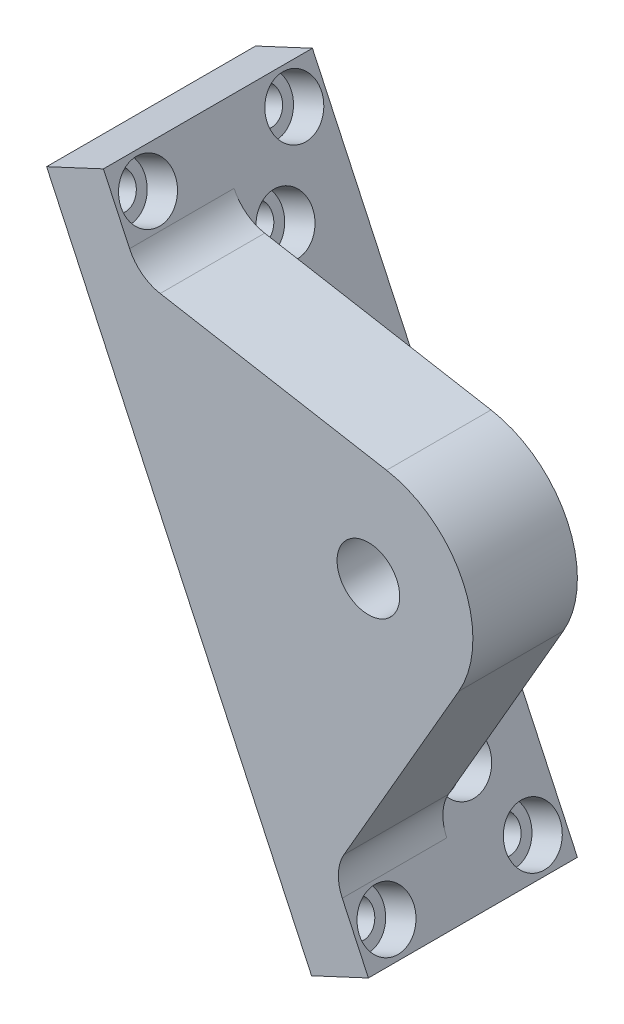
ISO-10303-21;
HEADER;
FILE_DESCRIPTION(('STEP AP214'),'2;1');
FILE_NAME('part.step','',(''),(''),'','','');
FILE_SCHEMA(('AUTOMOTIVE_DESIGN { 1 0 10303 214 1 1 1 1 }'));
ENDSEC;
DATA;
#1=APPLICATION_CONTEXT('core data for automotive mechanical design processes');
#2=APPLICATION_PROTOCOL_DEFINITION('international standard','automotive_design',2000,#1);
#3=PRODUCT_CONTEXT('',#1,'mechanical');
#4=PRODUCT('Part','Part','',(#3));
#5=PRODUCT_RELATED_PRODUCT_CATEGORY('part','',(#4));
#6=PRODUCT_DEFINITION_FORMATION('','',#4);
#7=PRODUCT_DEFINITION_CONTEXT('part definition',#1,'design');
#8=PRODUCT_DEFINITION('design','',#6,#7);
#9=PRODUCT_DEFINITION_SHAPE('','',#8);
#10=(LENGTH_UNIT() NAMED_UNIT(*) SI_UNIT(.MILLI.,.METRE.));
#11=(NAMED_UNIT(*) PLANE_ANGLE_UNIT() SI_UNIT($,.RADIAN.));
#12=(NAMED_UNIT(*) SI_UNIT($,.STERADIAN.) SOLID_ANGLE_UNIT());
#13=UNCERTAINTY_MEASURE_WITH_UNIT(LENGTH_MEASURE(1.E-05),#10,'distance_accuracy_value','');
#14=(GEOMETRIC_REPRESENTATION_CONTEXT(3) GLOBAL_UNCERTAINTY_ASSIGNED_CONTEXT((#13)) GLOBAL_UNIT_ASSIGNED_CONTEXT((#10,
#11,#12)) REPRESENTATION_CONTEXT('',''));
#15=CARTESIAN_POINT('',(0.,0.,0.));
#16=DIRECTION('',(0.,0.,1.));
#17=DIRECTION('',(1.,0.,0.));
#18=AXIS2_PLACEMENT_3D('',#15,#16,#17);
#19=CARTESIAN_POINT('',(-24.7746188840278,71.2007494086933,0.));
#20=DIRECTION('',(0.,0.,1.));
#21=DIRECTION('',(1.,0.,0.));
#22=AXIS2_PLACEMENT_3D('',#19,#20,#21);
#23=PLANE('',#22);
#24=DIRECTION('',(-0.4226182617407,0.90630778703665,0.));
#25=VECTOR('',#24,1.);
#26=CARTESIAN_POINT('',(-29.442801620826,27.6472680877639,0.));
#27=LINE('',#26,#25);
#28=CARTESIAN_POINT('',(-13.5946168055498,-6.3392739261105,0.));
#29=VERTEX_POINT('',#28);
#30=CARTESIAN_POINT('',(-76.9873560666547,129.606894129387,0.));
#31=VERTEX_POINT('',#30);
#32=EDGE_CURVE('E276',#29,#31,#27,.T.);
#33=ORIENTED_EDGE('',*,*,#32,.T.);
#34=DIRECTION('',(0.906307787036651,0.422618261740698,0.));
#35=VECTOR('',#34,1.);
#36=CARTESIAN_POINT('',(-77.8936638536913,129.184275867646,0.));
#37=LINE('',#36,#35);
#38=CARTESIAN_POINT('',(-63.3927392611049,135.946168055498,0.));
#39=VERTEX_POINT('',#38);
#40=EDGE_CURVE('E21',#31,#39,#37,.T.);
#41=ORIENTED_EDGE('',*,*,#40,.T.);
#42=DIRECTION('',(0.422618261740696,-0.906307787036652,0.));
#43=VECTOR('',#42,1.);
#44=CARTESIAN_POINT('',(-63.3927392611049,135.946168055498,0.));
#45=LINE('',#44,#43);
#46=CARTESIAN_POINT('',(0.,0.,0.));
#47=VERTEX_POINT('',#46);
#48=EDGE_CURVE('E400',#39,#47,#45,.T.);
#49=ORIENTED_EDGE('',*,*,#48,.T.);
#50=DIRECTION('',(-0.90630778703665,-0.4226182617407,0.));
#51=VECTOR('',#50,1.);
#52=CARTESIAN_POINT('',(0.,0.,0.));
#53=LINE('',#52,#51);
#54=EDGE_CURVE('E11',#47,#29,#53,.T.);
#55=ORIENTED_EDGE('',*,*,#54,.T.);
#56=EDGE_LOOP('',(#33,#41,#49,#55));
#57=FACE_BOUND('',#56,.T.);
#58=ADVANCED_FACE('F17',(#57),#23,.F.);
#59=CARTESIAN_POINT('',(0.,0.,0.));
#60=DIRECTION('',(0.4226182617407,-0.90630778703665,0.));
#61=DIRECTION('',(0.,0.,-1.));
#62=AXIS2_PLACEMENT_3D('',#59,#60,#61);
#63=PLANE('',#62);
#64=DIRECTION('',(0.,0.,-1.));
#65=VECTOR('',#64,1.);
#66=CARTESIAN_POINT('',(-13.5946168055498,-6.3392739261105,0.));
#67=LINE('',#66,#65);
#68=CARTESIAN_POINT('',(-13.5946168055498,-6.3392739261105,50.));
#69=VERTEX_POINT('',#68);
#70=EDGE_CURVE('E251',#69,#29,#67,.T.);
#71=ORIENTED_EDGE('',*,*,#70,.T.);
#72=ORIENTED_EDGE('',*,*,#54,.F.);
#73=DIRECTION('',(0.,0.,1.));
#74=VECTOR('',#73,1.);
#75=CARTESIAN_POINT('',(0.,0.,0.));
#76=LINE('',#75,#74);
#77=CARTESIAN_POINT('',(0.,0.,50.));
#78=VERTEX_POINT('',#77);
#79=EDGE_CURVE('E254',#47,#78,#76,.T.);
#80=ORIENTED_EDGE('',*,*,#79,.T.);
#81=DIRECTION('',(-0.90630778703665,-0.4226182617407,0.));
#82=VECTOR('',#81,1.);
#83=CARTESIAN_POINT('',(0.,0.,50.));
#84=LINE('',#83,#82);
#85=EDGE_CURVE('E247',#78,#69,#84,.T.);
#86=ORIENTED_EDGE('',*,*,#85,.T.);
#87=EDGE_LOOP('',(#71,#72,#80,#86));
#88=FACE_BOUND('',#87,.T.);
#89=ADVANCED_FACE('F249',(#88),#63,.T.);
#90=CARTESIAN_POINT('',(-77.8936638536913,129.184275867646,0.));
#91=DIRECTION('',(-0.422618261740698,0.906307787036651,0.));
#92=DIRECTION('',(0.,0.,1.));
#93=AXIS2_PLACEMENT_3D('',#90,#91,#92);
#94=PLANE('',#93);
#95=DIRECTION('',(0.,0.,1.));
#96=VECTOR('',#95,1.);
#97=CARTESIAN_POINT('',(-76.9873560666547,129.606894129387,0.));
#98=LINE('',#97,#96);
#99=CARTESIAN_POINT('',(-76.9873560666547,129.606894129387,50.));
#100=VERTEX_POINT('',#99);
#101=EDGE_CURVE('E283',#31,#100,#98,.T.);
#102=ORIENTED_EDGE('',*,*,#101,.T.);
#103=DIRECTION('',(0.906307787036651,0.422618261740698,0.));
#104=VECTOR('',#103,1.);
#105=CARTESIAN_POINT('',(-77.8936638536913,129.184275867646,50.));
#106=LINE('',#105,#104);
#107=CARTESIAN_POINT('',(-63.3927392611049,135.946168055498,50.));
#108=VERTEX_POINT('',#107);
#109=EDGE_CURVE('E267',#100,#108,#106,.T.);
#110=ORIENTED_EDGE('',*,*,#109,.T.);
#111=DIRECTION('',(0.,0.,1.));
#112=VECTOR('',#111,1.);
#113=CARTESIAN_POINT('',(-63.3927392611049,135.946168055498,0.));
#114=LINE('',#113,#112);
#115=EDGE_CURVE('E337',#39,#108,#114,.T.);
#116=ORIENTED_EDGE('',*,*,#115,.F.);
#117=ORIENTED_EDGE('',*,*,#40,.F.);
#118=EDGE_LOOP('',(#102,#110,#116,#117));
#119=FACE_BOUND('',#118,.T.);
#120=ADVANCED_FACE('F935',(#119),#94,.T.);
#121=CARTESIAN_POINT('',(-54.940374026291,117.820012314764,0.));
#122=DIRECTION('',(0.173543976887941,0.984826120737015,0.));
#123=DIRECTION('',(0.,0.,-1.));
#124=AXIS2_PLACEMENT_3D('',#121,#122,#123);
#125=PLANE('',#124);
#126=DIRECTION('',(0.,0.,-1.));
#127=VECTOR('',#126,1.);
#128=CARTESIAN_POINT('',(-49.8130315213259,116.91648285871,0.));
#129=LINE('',#128,#127);
#130=CARTESIAN_POINT('',(-49.8130315213259,116.91648285871,50.));
#131=VERTEX_POINT('',#130);
#132=CARTESIAN_POINT('',(-49.8130315213259,116.91648285871,25.));
#133=VERTEX_POINT('',#132);
#134=EDGE_CURVE('E307',#131,#133,#129,.T.);
#135=ORIENTED_EDGE('',*,*,#134,.F.);
#136=DIRECTION('',(0.984826120737015,-0.173543976887941,0.));
#137=VECTOR('',#136,1.);
#138=CARTESIAN_POINT('',(-54.940374026291,117.820012314764,50.));
#139=LINE('',#138,#137);
#140=CARTESIAN_POINT('',(4.33859942219853,107.373996940612,50.));
#141=VERTEX_POINT('',#140);
#142=EDGE_CURVE('E302',#131,#141,#139,.T.);
#143=ORIENTED_EDGE('',*,*,#142,.T.);
#144=DIRECTION('',(0.,0.,1.));
#145=VECTOR('',#144,1.);
#146=CARTESIAN_POINT('',(4.33859942219853,107.373996940612,0.));
#147=LINE('',#146,#145);
#148=CARTESIAN_POINT('',(4.33859942219853,107.373996940612,25.));
#149=VERTEX_POINT('',#148);
#150=EDGE_CURVE('E39',#149,#141,#147,.T.);
#151=ORIENTED_EDGE('',*,*,#150,.F.);
#152=DIRECTION('',(-0.984826120737015,0.173543976887941,0.));
#153=VECTOR('',#152,1.);
#154=CARTESIAN_POINT('',(-18.2291737525584,111.350842216935,25.));
#155=LINE('',#154,#153);
#156=EDGE_CURVE('E380',#149,#133,#155,.T.);
#157=ORIENTED_EDGE('',*,*,#156,.T.);
#158=EDGE_LOOP('',(#135,#143,#151,#157));
#159=FACE_BOUND('',#158,.T.);
#160=ADVANCED_FACE('F897',(#159),#125,.T.);
#161=CARTESIAN_POINT('',(0.,82.7533439221869,0.));
#162=DIRECTION('',(0.,0.,1.));
#163=DIRECTION('',(-0.865972495308307,0.500091628973636,0.));
#164=AXIS2_PLACEMENT_3D('',#161,#162,#163);
#165=CYLINDRICAL_SURFACE('',#164,25.);
#166=CARTESIAN_POINT('',(0.,82.7533439221869,25.));
#167=DIRECTION('',(0.,0.,1.));
#168=DIRECTION('',(-0.865972495308307,0.500091628973636,0.));
#169=AXIS2_PLACEMENT_3D('',#166,#167,#168);
#170=CIRCLE('',#169,25.);
#171=CARTESIAN_POINT('',(21.6493123827077,70.251053197846,25.));
#172=VERTEX_POINT('',#171);
#173=EDGE_CURVE('E377',#172,#149,#170,.T.);
#174=ORIENTED_EDGE('',*,*,#173,.T.);
#175=ORIENTED_EDGE('',*,*,#150,.T.);
#176=CARTESIAN_POINT('',(0.,82.7533439221869,50.));
#177=DIRECTION('',(0.,0.,-1.));
#178=DIRECTION('',(-0.865972495308307,0.500091628973636,0.));
#179=AXIS2_PLACEMENT_3D('',#176,#177,#178);
#180=CIRCLE('',#179,25.);
#181=CARTESIAN_POINT('',(21.6493123827077,70.251053197846,50.));
#182=VERTEX_POINT('',#181);
#183=EDGE_CURVE('E306',#141,#182,#180,.T.);
#184=ORIENTED_EDGE('',*,*,#183,.T.);
#185=DIRECTION('',(0.,0.,1.));
#186=VECTOR('',#185,1.);
#187=CARTESIAN_POINT('',(21.6493123827077,70.251053197846,0.));
#188=LINE('',#187,#186);
#189=EDGE_CURVE('E338',#172,#182,#188,.T.);
#190=ORIENTED_EDGE('',*,*,#189,.F.);
#191=EDGE_LOOP('',(#174,#175,#184,#190));
#192=FACE_BOUND('',#191,.T.);
#193=ADVANCED_FACE('F892',(#192),#165,.T.);
#194=CARTESIAN_POINT('',(0.,0.,25.));
#195=DIRECTION('',(0.,0.,1.));
#196=DIRECTION('',(1.,0.,0.));
#197=AXIS2_PLACEMENT_3D('',#194,#195,#196);
#198=PLANE('',#197);
#199=CARTESIAN_POINT('',(0.,82.7533439221869,25.));
#200=DIRECTION('',(0.,0.,1.));
#201=DIRECTION('',(-1.,0.,0.));
#202=AXIS2_PLACEMENT_3D('',#199,#200,#201);
#203=CIRCLE('',#202,7.5);
#204=CARTESIAN_POINT('',(7.5,82.7533439221869,25.));
#205=VERTEX_POINT('',#204);
#206=EDGE_CURVE('E357',#205,#205,#203,.T.);
#207=ORIENTED_EDGE('',*,*,#206,.T.);
#208=EDGE_LOOP('',(#207));
#209=FACE_BOUND('',#208,.T.);
#210=DIRECTION('',(0.4226182617407,-0.90630778703665,0.));
#211=VECTOR('',#210,1.);
#212=CARTESIAN_POINT('',(-4.226182617407,9.0630778703665,25.));
#213=LINE('',#212,#211);
#214=CARTESIAN_POINT('',(-57.140669622813,122.538561448673,25.));
#215=VERTEX_POINT('',#214);
#216=CARTESIAN_POINT('',(-6.25206963829196,13.4076066068248,25.));
#217=VERTEX_POINT('',#216);
#218=EDGE_CURVE('E333',#215,#217,#213,.T.);
#219=ORIENTED_EDGE('',*,*,#218,.F.);
#220=CARTESIAN_POINT('',(-48.0775917524465,126.76474406608,25.));
#221=DIRECTION('',(0.,0.,-1.));
#222=DIRECTION('',(-0.608719456886394,-0.793385544869538,0.));
#223=AXIS2_PLACEMENT_3D('',#220,#221,#222);
#224=CIRCLE('',#223,10.);
#225=EDGE_CURVE('E342',#133,#215,#224,.T.);
#226=ORIENTED_EDGE('',*,*,#225,.F.);
#227=ORIENTED_EDGE('',*,*,#156,.F.);
#228=ORIENTED_EDGE('',*,*,#173,.F.);
#229=DIRECTION('',(0.500091628973637,0.865972495308306,0.));
#230=VECTOR('',#229,1.);
#231=CARTESIAN_POINT('',(3.73049928661717,39.2223408764033,25.));
#232=LINE('',#231,#230);
#233=CARTESIAN_POINT('',(-5.84871672100853,22.6347055139682,25.));
#234=VERTEX_POINT('',#233);
#235=EDGE_CURVE('E343',#234,#172,#232,.T.);
#236=ORIENTED_EDGE('',*,*,#235,.F.);
#237=CARTESIAN_POINT('',(2.81100823207453,17.6337892242318,25.));
#238=DIRECTION('',(0.,0.,-1.));
#239=DIRECTION('',(-0.999045912559926,0.0436722405803167,0.));
#240=AXIS2_PLACEMENT_3D('',#237,#238,#239);
#241=CIRCLE('',#240,10.);
#242=EDGE_CURVE('E291',#217,#234,#241,.T.);
#243=ORIENTED_EDGE('',*,*,#242,.F.);
#244=EDGE_LOOP('',(#219,#226,#227,#228,#236,#243));
#245=FACE_BOUND('',#244,.T.);
#246=ADVANCED_FACE('F847',(#209,#245),#198,.F.);
#247=CARTESIAN_POINT('',(-12.2327148334217,2.57112578536788,42.5));
#248=DIRECTION('',(0.90630778703665,0.4226182617407,0.));
#249=DIRECTION('',(0.,0.,-1.));
#250=AXIS2_PLACEMENT_3D('',#247,#248,#249);
#251=CYLINDRICAL_SURFACE('',#250,4.1);
#252=CARTESIAN_POINT('',(-10.4200992593484,3.41636230884927,42.5));
#253=DIRECTION('',(0.90630778703665,0.4226182617407,0.));
#254=DIRECTION('',(0.,0.,-1.));
#255=AXIS2_PLACEMENT_3D('',#252,#253,#254);
#256=CIRCLE('',#255,4.1);
#257=CARTESIAN_POINT('',(-10.4200992593484,3.41636230884927,46.6));
#258=VERTEX_POINT('',#257);
#259=EDGE_CURVE('E315',#258,#258,#256,.T.);
#260=ORIENTED_EDGE('',*,*,#259,.T.);
#261=DIRECTION('',(-0.90630778703665,-0.4226182617407,0.));
#262=VECTOR('',#261,1.);
#263=CARTESIAN_POINT('',(-12.2327148334217,2.57112578536788,46.6));
#264=LINE('',#263,#262);
#265=CARTESIAN_POINT('',(-16.764253768605,0.458034476664371,46.6));
#266=VERTEX_POINT('',#265);
#267=EDGE_CURVE('E52',#258,#266,#264,.T.);
#268=ORIENTED_EDGE('',*,*,#267,.T.);
#269=CARTESIAN_POINT('',(-16.764253768605,0.458034476664371,42.5));
#270=DIRECTION('',(-0.90630778703665,-0.4226182617407,0.));
#271=DIRECTION('',(0.,0.,-1.));
#272=AXIS2_PLACEMENT_3D('',#269,#270,#271);
#273=CIRCLE('',#272,4.1);
#274=EDGE_CURVE('E260',#266,#266,#273,.T.);
#275=ORIENTED_EDGE('',*,*,#274,.T.);
#276=ORIENTED_EDGE('',*,*,#267,.F.);
#277=EDGE_LOOP('',(#260,#268,#275,#276));
#278=FACE_BOUND('',#277,.T.);
#279=ADVANCED_FACE('F838',(#278),#251,.F.);
#280=CARTESIAN_POINT('',(-6.79486811120184,5.10683535581207,42.5));
#281=DIRECTION('',(0.90630778703665,0.4226182617407,0.));
#282=DIRECTION('',(0.,0.,-1.));
#283=AXIS2_PLACEMENT_3D('',#280,#281,#282);
#284=CYLINDRICAL_SURFACE('',#283,6.5);
#285=CARTESIAN_POINT('',(-3.16963696305525,6.79730840277487,42.5));
#286=DIRECTION('',(-0.90630778703665,-0.4226182617407,0.));
#287=DIRECTION('',(0.,0.,-1.));
#288=AXIS2_PLACEMENT_3D('',#285,#286,#287);
#289=CIRCLE('',#288,6.5);
#290=CARTESIAN_POINT('',(-3.16963696305525,6.79730840277487,49.));
#291=VERTEX_POINT('',#290);
#292=EDGE_CURVE('E336',#291,#291,#289,.T.);
#293=ORIENTED_EDGE('',*,*,#292,.F.);
#294=DIRECTION('',(-0.90630778703665,-0.4226182617407,0.));
#295=VECTOR('',#294,1.);
#296=CARTESIAN_POINT('',(-6.79486811120184,5.10683535581207,49.));
#297=LINE('',#296,#295);
#298=CARTESIAN_POINT('',(-10.4200992593484,3.41636230884927,49.));
#299=VERTEX_POINT('',#298);
#300=EDGE_CURVE('E312',#291,#299,#297,.T.);
#301=ORIENTED_EDGE('',*,*,#300,.T.);
#302=CARTESIAN_POINT('',(-10.4200992593484,3.41636230884927,42.5));
#303=DIRECTION('',(0.90630778703665,0.4226182617407,0.));
#304=DIRECTION('',(0.,0.,-1.));
#305=AXIS2_PLACEMENT_3D('',#302,#303,#304);
#306=CIRCLE('',#305,6.5);
#307=EDGE_CURVE('E353',#299,#299,#306,.T.);
#308=ORIENTED_EDGE('',*,*,#307,.F.);
#309=ORIENTED_EDGE('',*,*,#300,.F.);
#310=EDGE_LOOP('',(#293,#301,#308,#309));
#311=FACE_BOUND('',#310,.T.);
#312=ADVANCED_FACE('F493',(#311),#284,.F.);
#313=CARTESIAN_POINT('',(-10.4200992593484,3.41636230884927,42.5));
#314=DIRECTION('',(0.90630778703665,0.4226182617407,0.));
#315=DIRECTION('',(0.,0.,-1.));
#316=AXIS2_PLACEMENT_3D('',#313,#314,#315);
#317=PLANE('',#316);
#318=ORIENTED_EDGE('',*,*,#259,.F.);
#319=EDGE_LOOP('',(#318));
#320=FACE_BOUND('',#319,.T.);
#321=ORIENTED_EDGE('',*,*,#307,.T.);
#322=EDGE_LOOP('',(#321));
#323=FACE_BOUND('',#322,.T.);
#324=ADVANCED_FACE('F490',(#320,#323),#317,.T.);
#325=CARTESIAN_POINT('',(-12.2327148334217,2.57112578536788,7.5));
#326=DIRECTION('',(0.90630778703665,0.4226182617407,0.));
#327=DIRECTION('',(0.,0.,-1.));
#328=AXIS2_PLACEMENT_3D('',#325,#326,#327);
#329=CYLINDRICAL_SURFACE('',#328,4.1);
#330=CARTESIAN_POINT('',(-10.4200992593484,3.41636230884927,7.5));
#331=DIRECTION('',(0.90630778703665,0.4226182617407,0.));
#332=DIRECTION('',(0.,0.,-1.));
#333=AXIS2_PLACEMENT_3D('',#330,#331,#332);
#334=CIRCLE('',#333,4.1);
#335=CARTESIAN_POINT('',(-10.4200992593484,3.41636230884927,11.6));
#336=VERTEX_POINT('',#335);
#337=EDGE_CURVE('E376',#336,#336,#334,.T.);
#338=ORIENTED_EDGE('',*,*,#337,.T.);
#339=DIRECTION('',(-0.90630778703665,-0.4226182617407,0.));
#340=VECTOR('',#339,1.);
#341=CARTESIAN_POINT('',(-12.2327148334217,2.57112578536788,11.6));
#342=LINE('',#341,#340);
#343=CARTESIAN_POINT('',(-16.764253768605,0.458034476664371,11.6));
#344=VERTEX_POINT('',#343);
#345=EDGE_CURVE('E375',#336,#344,#342,.T.);
#346=ORIENTED_EDGE('',*,*,#345,.T.);
#347=CARTESIAN_POINT('',(-16.764253768605,0.458034476664371,7.5));
#348=DIRECTION('',(-0.90630778703665,-0.4226182617407,0.));
#349=DIRECTION('',(0.,0.,-1.));
#350=AXIS2_PLACEMENT_3D('',#347,#348,#349);
#351=CIRCLE('',#350,4.1);
#352=EDGE_CURVE('E439',#344,#344,#351,.T.);
#353=ORIENTED_EDGE('',*,*,#352,.T.);
#354=ORIENTED_EDGE('',*,*,#345,.F.);
#355=EDGE_LOOP('',(#338,#346,#353,#354));
#356=FACE_BOUND('',#355,.T.);
#357=ADVANCED_FACE('F855',(#356),#329,.F.);
#358=CARTESIAN_POINT('',(-6.79486811120184,5.10683535581207,7.5));
#359=DIRECTION('',(0.90630778703665,0.4226182617407,0.));
#360=DIRECTION('',(0.,0.,-1.));
#361=AXIS2_PLACEMENT_3D('',#358,#359,#360);
#362=CYLINDRICAL_SURFACE('',#361,6.5);
#363=CARTESIAN_POINT('',(-3.16963696305525,6.79730840277487,7.5));
#364=DIRECTION('',(-0.90630778703665,-0.4226182617407,0.));
#365=DIRECTION('',(0.,0.,-1.));
#366=AXIS2_PLACEMENT_3D('',#363,#364,#365);
#367=CIRCLE('',#366,6.5);
#368=CARTESIAN_POINT('',(-3.16963696305525,6.79730840277487,14.));
#369=VERTEX_POINT('',#368);
#370=EDGE_CURVE('E386',#369,#369,#367,.T.);
#371=ORIENTED_EDGE('',*,*,#370,.F.);
#372=DIRECTION('',(-0.90630778703665,-0.4226182617407,0.));
#373=VECTOR('',#372,1.);
#374=CARTESIAN_POINT('',(-6.79486811120184,5.10683535581207,14.));
#375=LINE('',#374,#373);
#376=CARTESIAN_POINT('',(-10.4200992593484,3.41636230884927,14.));
#377=VERTEX_POINT('',#376);
#378=EDGE_CURVE('E372',#369,#377,#375,.T.);
#379=ORIENTED_EDGE('',*,*,#378,.T.);
#380=CARTESIAN_POINT('',(-10.4200992593484,3.41636230884927,7.5));
#381=DIRECTION('',(0.90630778703665,0.4226182617407,0.));
#382=DIRECTION('',(0.,0.,-1.));
#383=AXIS2_PLACEMENT_3D('',#380,#381,#382);
#384=CIRCLE('',#383,6.5);
#385=EDGE_CURVE('E479',#377,#377,#384,.T.);
#386=ORIENTED_EDGE('',*,*,#385,.F.);
#387=ORIENTED_EDGE('',*,*,#378,.F.);
#388=EDGE_LOOP('',(#371,#379,#386,#387));
#389=FACE_BOUND('',#388,.T.);
#390=ADVANCED_FACE('F926',(#389),#362,.F.);
#391=CARTESIAN_POINT('',(-10.4200992593484,3.41636230884927,7.5));
#392=DIRECTION('',(0.90630778703665,0.4226182617407,0.));
#393=DIRECTION('',(0.,0.,-1.));
#394=AXIS2_PLACEMENT_3D('',#391,#392,#393);
#395=PLANE('',#394);
#396=ORIENTED_EDGE('',*,*,#337,.F.);
#397=EDGE_LOOP('',(#396));
#398=FACE_BOUND('',#397,.T.);
#399=ORIENTED_EDGE('',*,*,#385,.T.);
#400=EDGE_LOOP('',(#399));
#401=FACE_BOUND('',#400,.T.);
#402=ADVANCED_FACE('F921',(#398,#401),#395,.T.);
#403=CARTESIAN_POINT('',(-69.2861801684162,124.922677035316,7.5));
#404=DIRECTION('',(0.90630778703665,0.4226182617407,0.));
#405=DIRECTION('',(0.,0.,-1.));
#406=AXIS2_PLACEMENT_3D('',#403,#404,#405);
#407=CYLINDRICAL_SURFACE('',#406,4.1);
#408=CARTESIAN_POINT('',(-67.4735645943429,125.767913558797,7.5));
#409=DIRECTION('',(0.90630778703665,0.4226182617407,0.));
#410=DIRECTION('',(0.,0.,-1.));
#411=AXIS2_PLACEMENT_3D('',#408,#409,#410);
#412=CIRCLE('',#411,4.1);
#413=CARTESIAN_POINT('',(-67.4735645943429,125.767913558797,11.6));
#414=VERTEX_POINT('',#413);
#415=EDGE_CURVE('E287',#414,#414,#412,.T.);
#416=ORIENTED_EDGE('',*,*,#415,.T.);
#417=DIRECTION('',(-0.90630778703665,-0.4226182617407,0.));
#418=VECTOR('',#417,1.);
#419=CARTESIAN_POINT('',(-69.2861801684162,124.922677035316,11.6));
#420=LINE('',#419,#418);
#421=CARTESIAN_POINT('',(-73.8177191035995,122.809585726612,11.6));
#422=VERTEX_POINT('',#421);
#423=EDGE_CURVE('E412',#414,#422,#420,.T.);
#424=ORIENTED_EDGE('',*,*,#423,.T.);
#425=CARTESIAN_POINT('',(-73.8177191035995,122.809585726612,7.5));
#426=DIRECTION('',(-0.90630778703665,-0.4226182617407,0.));
#427=DIRECTION('',(0.,0.,-1.));
#428=AXIS2_PLACEMENT_3D('',#425,#426,#427);
#429=CIRCLE('',#428,4.1);
#430=EDGE_CURVE('E456',#422,#422,#429,.T.);
#431=ORIENTED_EDGE('',*,*,#430,.T.);
#432=ORIENTED_EDGE('',*,*,#423,.F.);
#433=EDGE_LOOP('',(#416,#424,#431,#432));
#434=FACE_BOUND('',#433,.T.);
#435=ADVANCED_FACE('F828',(#434),#407,.F.);
#436=CARTESIAN_POINT('',(-63.8483334461963,127.45838660576,7.5));
#437=DIRECTION('',(0.90630778703665,0.4226182617407,0.));
#438=DIRECTION('',(0.,0.,-1.));
#439=AXIS2_PLACEMENT_3D('',#436,#437,#438);
#440=CYLINDRICAL_SURFACE('',#439,6.5);
#441=CARTESIAN_POINT('',(-60.2231022980497,129.148859652723,7.5));
#442=DIRECTION('',(-0.90630778703665,-0.4226182617407,0.));
#443=DIRECTION('',(0.,0.,-1.));
#444=AXIS2_PLACEMENT_3D('',#441,#442,#443);
#445=CIRCLE('',#444,6.5);
#446=CARTESIAN_POINT('',(-60.2231022980497,129.148859652723,14.));
#447=VERTEX_POINT('',#446);
#448=EDGE_CURVE('E390',#447,#447,#445,.T.);
#449=ORIENTED_EDGE('',*,*,#448,.F.);
#450=DIRECTION('',(-0.90630778703665,-0.4226182617407,0.));
#451=VECTOR('',#450,1.);
#452=CARTESIAN_POINT('',(-63.8483334461963,127.45838660576,14.));
#453=LINE('',#452,#451);
#454=CARTESIAN_POINT('',(-67.4735645943429,125.767913558797,14.));
#455=VERTEX_POINT('',#454);
#456=EDGE_CURVE('E409',#447,#455,#453,.T.);
#457=ORIENTED_EDGE('',*,*,#456,.T.);
#458=CARTESIAN_POINT('',(-67.4735645943429,125.767913558797,7.5));
#459=DIRECTION('',(0.90630778703665,0.4226182617407,0.));
#460=DIRECTION('',(0.,0.,-1.));
#461=AXIS2_PLACEMENT_3D('',#458,#459,#460);
#462=CIRCLE('',#461,6.5);
#463=EDGE_CURVE('E429',#455,#455,#462,.T.);
#464=ORIENTED_EDGE('',*,*,#463,.F.);
#465=ORIENTED_EDGE('',*,*,#456,.F.);
#466=EDGE_LOOP('',(#449,#457,#464,#465));
#467=FACE_BOUND('',#466,.T.);
#468=ADVANCED_FACE('F799',(#467),#440,.F.);
#469=CARTESIAN_POINT('',(-67.4735645943429,125.767913558797,7.5));
#470=DIRECTION('',(0.90630778703665,0.4226182617407,0.));
#471=DIRECTION('',(0.,0.,-1.));
#472=AXIS2_PLACEMENT_3D('',#469,#470,#471);
#473=PLANE('',#472);
#474=ORIENTED_EDGE('',*,*,#415,.F.);
#475=EDGE_LOOP('',(#474));
#476=FACE_BOUND('',#475,.T.);
#477=ORIENTED_EDGE('',*,*,#463,.T.);
#478=EDGE_LOOP('',(#477));
#479=FACE_BOUND('',#478,.T.);
#480=ADVANCED_FACE('F793',(#476,#479),#473,.T.);
#481=CARTESIAN_POINT('',(-69.2861801684162,124.922677035316,42.5));
#482=DIRECTION('',(0.90630778703665,0.4226182617407,0.));
#483=DIRECTION('',(0.,0.,-1.));
#484=AXIS2_PLACEMENT_3D('',#481,#482,#483);
#485=CYLINDRICAL_SURFACE('',#484,4.1);
#486=CARTESIAN_POINT('',(-67.4735645943429,125.767913558797,42.5));
#487=DIRECTION('',(0.90630778703665,0.4226182617407,0.));
#488=DIRECTION('',(0.,0.,-1.));
#489=AXIS2_PLACEMENT_3D('',#486,#487,#488);
#490=CIRCLE('',#489,4.1);
#491=CARTESIAN_POINT('',(-67.4735645943429,125.767913558797,46.6));
#492=VERTEX_POINT('',#491);
#493=EDGE_CURVE('E436',#492,#492,#490,.T.);
#494=ORIENTED_EDGE('',*,*,#493,.T.);
#495=DIRECTION('',(-0.90630778703665,-0.4226182617407,0.));
#496=VECTOR('',#495,1.);
#497=CARTESIAN_POINT('',(-69.2861801684162,124.922677035316,46.6));
#498=LINE('',#497,#496);
#499=CARTESIAN_POINT('',(-73.8177191035995,122.809585726612,46.6));
#500=VERTEX_POINT('',#499);
#501=EDGE_CURVE('E433',#492,#500,#498,.T.);
#502=ORIENTED_EDGE('',*,*,#501,.T.);
#503=CARTESIAN_POINT('',(-73.8177191035995,122.809585726612,42.5));
#504=DIRECTION('',(-0.90630778703665,-0.4226182617407,0.));
#505=DIRECTION('',(0.,0.,-1.));
#506=AXIS2_PLACEMENT_3D('',#503,#504,#505);
#507=CIRCLE('',#506,4.1);
#508=EDGE_CURVE('E346',#500,#500,#507,.T.);
#509=ORIENTED_EDGE('',*,*,#508,.T.);
#510=ORIENTED_EDGE('',*,*,#501,.F.);
#511=EDGE_LOOP('',(#494,#502,#509,#510));
#512=FACE_BOUND('',#511,.T.);
#513=ADVANCED_FACE('F798',(#512),#485,.F.);
#514=CARTESIAN_POINT('',(-63.8483334461963,127.45838660576,42.5));
#515=DIRECTION('',(0.90630778703665,0.4226182617407,0.));
#516=DIRECTION('',(0.,0.,-1.));
#517=AXIS2_PLACEMENT_3D('',#514,#515,#516);
#518=CYLINDRICAL_SURFACE('',#517,6.5);
#519=CARTESIAN_POINT('',(-60.2231022980497,129.148859652723,42.5));
#520=DIRECTION('',(-0.90630778703665,-0.4226182617407,0.));
#521=DIRECTION('',(0.,0.,-1.));
#522=AXIS2_PLACEMENT_3D('',#519,#520,#521);
#523=CIRCLE('',#522,6.5);
#524=CARTESIAN_POINT('',(-60.2231022980497,129.148859652723,49.));
#525=VERTEX_POINT('',#524);
#526=EDGE_CURVE('E394',#525,#525,#523,.T.);
#527=ORIENTED_EDGE('',*,*,#526,.F.);
#528=DIRECTION('',(-0.90630778703665,-0.4226182617407,0.));
#529=VECTOR('',#528,1.);
#530=CARTESIAN_POINT('',(-63.8483334461963,127.45838660576,49.));
#531=LINE('',#530,#529);
#532=CARTESIAN_POINT('',(-67.4735645943429,125.767913558797,49.));
#533=VERTEX_POINT('',#532);
#534=EDGE_CURVE('E129',#525,#533,#531,.T.);
#535=ORIENTED_EDGE('',*,*,#534,.T.);
#536=CARTESIAN_POINT('',(-67.4735645943429,125.767913558797,42.5));
#537=DIRECTION('',(0.90630778703665,0.4226182617407,0.));
#538=DIRECTION('',(0.,0.,-1.));
#539=AXIS2_PLACEMENT_3D('',#536,#537,#538);
#540=CIRCLE('',#539,6.5);
#541=EDGE_CURVE('E423',#533,#533,#540,.T.);
#542=ORIENTED_EDGE('',*,*,#541,.F.);
#543=ORIENTED_EDGE('',*,*,#534,.F.);
#544=EDGE_LOOP('',(#527,#535,#542,#543));
#545=FACE_BOUND('',#544,.T.);
#546=ADVANCED_FACE('F753',(#545),#518,.F.);
#547=CARTESIAN_POINT('',(-67.4735645943429,125.767913558797,42.5));
#548=DIRECTION('',(0.90630778703665,0.4226182617407,0.));
#549=DIRECTION('',(0.,0.,-1.));
#550=AXIS2_PLACEMENT_3D('',#547,#548,#549);
#551=PLANE('',#550);
#552=ORIENTED_EDGE('',*,*,#493,.F.);
#553=EDGE_LOOP('',(#552));
#554=FACE_BOUND('',#553,.T.);
#555=ORIENTED_EDGE('',*,*,#541,.T.);
#556=EDGE_LOOP('',(#555));
#557=FACE_BOUND('',#556,.T.);
#558=ADVANCED_FACE('F747',(#554,#557),#551,.T.);
#559=CARTESIAN_POINT('',(-61.890360587954,109.062290762174,17.));
#560=DIRECTION('',(0.90630778703665,0.4226182617407,0.));
#561=DIRECTION('',(0.,0.,-1.));
#562=AXIS2_PLACEMENT_3D('',#559,#560,#561);
#563=CYLINDRICAL_SURFACE('',#562,4.1);
#564=CARTESIAN_POINT('',(-60.0777450138807,109.907527285656,17.));
#565=DIRECTION('',(0.90630778703665,0.4226182617407,0.));
#566=DIRECTION('',(0.,0.,-1.));
#567=AXIS2_PLACEMENT_3D('',#564,#565,#566);
#568=CIRCLE('',#567,4.1);
#569=CARTESIAN_POINT('',(-60.0777450138807,109.907527285656,21.1));
#570=VERTEX_POINT('',#569);
#571=EDGE_CURVE('E371',#570,#570,#568,.T.);
#572=ORIENTED_EDGE('',*,*,#571,.T.);
#573=DIRECTION('',(-0.90630778703665,-0.4226182617407,0.));
#574=VECTOR('',#573,1.);
#575=CARTESIAN_POINT('',(-61.890360587954,109.062290762174,21.1));
#576=LINE('',#575,#574);
#577=CARTESIAN_POINT('',(-66.4218995231372,106.949199453471,21.1));
#578=VERTEX_POINT('',#577);
#579=EDGE_CURVE('E117',#570,#578,#576,.T.);
#580=ORIENTED_EDGE('',*,*,#579,.T.);
#581=CARTESIAN_POINT('',(-66.4218995231372,106.949199453471,17.));
#582=DIRECTION('',(-0.90630778703665,-0.4226182617407,0.));
#583=DIRECTION('',(0.,0.,-1.));
#584=AXIS2_PLACEMENT_3D('',#581,#582,#583);
#585=CIRCLE('',#584,4.1);
#586=EDGE_CURVE('E323',#578,#578,#585,.T.);
#587=ORIENTED_EDGE('',*,*,#586,.T.);
#588=ORIENTED_EDGE('',*,*,#579,.F.);
#589=EDGE_LOOP('',(#572,#580,#587,#588));
#590=FACE_BOUND('',#589,.T.);
#591=ADVANCED_FACE('F752',(#590),#563,.F.);
#592=CARTESIAN_POINT('',(-56.4525138657341,111.598000332618,17.));
#593=DIRECTION('',(0.90630778703665,0.4226182617407,0.));
#594=DIRECTION('',(0.,0.,-1.));
#595=AXIS2_PLACEMENT_3D('',#592,#593,#594);
#596=CYLINDRICAL_SURFACE('',#595,6.5);
#597=CARTESIAN_POINT('',(-52.8272827175875,113.288473379581,17.));
#598=DIRECTION('',(-0.90630778703665,-0.4226182617407,0.));
#599=DIRECTION('',(0.,0.,-1.));
#600=AXIS2_PLACEMENT_3D('',#597,#598,#599);
#601=CIRCLE('',#600,6.5);
#602=CARTESIAN_POINT('',(-52.8272827175875,113.288473379581,23.5));
#603=VERTEX_POINT('',#602);
#604=EDGE_CURVE('E332',#603,#603,#601,.T.);
#605=ORIENTED_EDGE('',*,*,#604,.F.);
#606=DIRECTION('',(-0.90630778703665,-0.4226182617407,0.));
#607=VECTOR('',#606,1.);
#608=CARTESIAN_POINT('',(-56.4525138657341,111.598000332618,23.5));
#609=LINE('',#608,#607);
#610=CARTESIAN_POINT('',(-60.0777450138807,109.907527285656,23.5));
#611=VERTEX_POINT('',#610);
#612=EDGE_CURVE('E406',#603,#611,#609,.T.);
#613=ORIENTED_EDGE('',*,*,#612,.T.);
#614=CARTESIAN_POINT('',(-60.0777450138807,109.907527285656,17.));
#615=DIRECTION('',(0.90630778703665,0.4226182617407,0.));
#616=DIRECTION('',(0.,0.,-1.));
#617=AXIS2_PLACEMENT_3D('',#614,#615,#616);
#618=CIRCLE('',#617,6.5);
#619=EDGE_CURVE('E367',#611,#611,#618,.T.);
#620=ORIENTED_EDGE('',*,*,#619,.F.);
#621=ORIENTED_EDGE('',*,*,#612,.F.);
#622=EDGE_LOOP('',(#605,#613,#620,#621));
#623=FACE_BOUND('',#622,.T.);
#624=ADVANCED_FACE('F766',(#623),#596,.F.);
#625=CARTESIAN_POINT('',(-60.0777450138807,109.907527285656,17.));
#626=DIRECTION('',(0.90630778703665,0.4226182617407,0.));
#627=DIRECTION('',(0.,0.,-1.));
#628=AXIS2_PLACEMENT_3D('',#625,#626,#627);
#629=PLANE('',#628);
#630=ORIENTED_EDGE('',*,*,#571,.F.);
#631=EDGE_LOOP('',(#630));
#632=FACE_BOUND('',#631,.T.);
#633=ORIENTED_EDGE('',*,*,#619,.T.);
#634=EDGE_LOOP('',(#633));
#635=FACE_BOUND('',#634,.T.);
#636=ADVANCED_FACE('F760',(#632,#635),#629,.T.);
#637=CARTESIAN_POINT('',(-40.759447500919,63.7469014103417,17.));
#638=DIRECTION('',(0.90630778703665,0.4226182617407,0.));
#639=DIRECTION('',(0.,0.,-1.));
#640=AXIS2_PLACEMENT_3D('',#637,#638,#639);
#641=CYLINDRICAL_SURFACE('',#640,4.1);
#642=CARTESIAN_POINT('',(-38.9468319268457,64.5921379338232,17.));
#643=DIRECTION('',(0.90630778703665,0.4226182617407,0.));
#644=DIRECTION('',(0.,0.,-1.));
#645=AXIS2_PLACEMENT_3D('',#642,#643,#644);
#646=CIRCLE('',#645,4.1);
#647=CARTESIAN_POINT('',(-38.9468319268457,64.5921379338231,21.1));
#648=VERTEX_POINT('',#647);
#649=EDGE_CURVE('E297',#648,#648,#646,.T.);
#650=ORIENTED_EDGE('',*,*,#649,.T.);
#651=DIRECTION('',(-0.90630778703665,-0.4226182617407,0.));
#652=VECTOR('',#651,1.);
#653=CARTESIAN_POINT('',(-40.759447500919,63.7469014103417,21.1));
#654=LINE('',#653,#652);
#655=CARTESIAN_POINT('',(-45.2909864361022,61.6338101016382,21.1));
#656=VERTEX_POINT('',#655);
#657=EDGE_CURVE('E296',#648,#656,#654,.T.);
#658=ORIENTED_EDGE('',*,*,#657,.T.);
#659=CARTESIAN_POINT('',(-45.2909864361022,61.6338101016382,17.));
#660=DIRECTION('',(-0.90630778703665,-0.4226182617407,0.));
#661=DIRECTION('',(0.,0.,-1.));
#662=AXIS2_PLACEMENT_3D('',#659,#660,#661);
#663=CIRCLE('',#662,4.1);
#664=EDGE_CURVE('E301',#656,#656,#663,.T.);
#665=ORIENTED_EDGE('',*,*,#664,.T.);
#666=ORIENTED_EDGE('',*,*,#657,.F.);
#667=EDGE_LOOP('',(#650,#658,#665,#666));
#668=FACE_BOUND('',#667,.T.);
#669=ADVANCED_FACE('F765',(#668),#641,.F.);
#670=CARTESIAN_POINT('',(-35.3216007786991,66.2826109807859,17.));
#671=DIRECTION('',(0.90630778703665,0.4226182617407,0.));
#672=DIRECTION('',(0.,0.,-1.));
#673=AXIS2_PLACEMENT_3D('',#670,#671,#672);
#674=CYLINDRICAL_SURFACE('',#673,6.5);
#675=CARTESIAN_POINT('',(-31.6963696305525,67.9730840277487,17.));
#676=DIRECTION('',(-0.90630778703665,-0.4226182617407,0.));
#677=DIRECTION('',(0.,0.,-1.));
#678=AXIS2_PLACEMENT_3D('',#675,#676,#677);
#679=CIRCLE('',#678,6.5);
#680=CARTESIAN_POINT('',(-31.6963696305525,67.9730840277487,23.5));
#681=VERTEX_POINT('',#680);
#682=EDGE_CURVE('E327',#681,#681,#679,.T.);
#683=ORIENTED_EDGE('',*,*,#682,.F.);
#684=DIRECTION('',(-0.90630778703665,-0.4226182617407,0.));
#685=VECTOR('',#684,1.);
#686=CARTESIAN_POINT('',(-35.3216007786991,66.2826109807859,23.5));
#687=LINE('',#686,#685);
#688=CARTESIAN_POINT('',(-38.9468319268457,64.5921379338232,23.5));
#689=VERTEX_POINT('',#688);
#690=EDGE_CURVE('E293',#681,#689,#687,.T.);
#691=ORIENTED_EDGE('',*,*,#690,.T.);
#692=CARTESIAN_POINT('',(-38.9468319268457,64.5921379338232,17.));
#693=DIRECTION('',(0.90630778703665,0.4226182617407,0.));
#694=DIRECTION('',(0.,0.,-1.));
#695=AXIS2_PLACEMENT_3D('',#692,#693,#694);
#696=CIRCLE('',#695,6.5);
#697=EDGE_CURVE('E416',#689,#689,#696,.T.);
#698=ORIENTED_EDGE('',*,*,#697,.F.);
#699=ORIENTED_EDGE('',*,*,#690,.F.);
#700=EDGE_LOOP('',(#683,#691,#698,#699));
#701=FACE_BOUND('',#700,.T.);
#702=ADVANCED_FACE('F950',(#701),#674,.F.);
#703=CARTESIAN_POINT('',(-38.9468319268457,64.5921379338232,17.));
#704=DIRECTION('',(0.90630778703665,0.4226182617407,0.));
#705=DIRECTION('',(0.,0.,-1.));
#706=AXIS2_PLACEMENT_3D('',#703,#704,#705);
#707=PLANE('',#706);
#708=ORIENTED_EDGE('',*,*,#649,.F.);
#709=EDGE_LOOP('',(#708));
#710=FACE_BOUND('',#709,.T.);
#711=ORIENTED_EDGE('',*,*,#697,.T.);
#712=EDGE_LOOP('',(#711));
#713=FACE_BOUND('',#712,.T.);
#714=ADVANCED_FACE('F19',(#710,#713),#707,.T.);
#715=CARTESIAN_POINT('',(-19.628534413884,18.4315120585092,17.));
#716=DIRECTION('',(0.90630778703665,0.4226182617407,0.));
#717=DIRECTION('',(0.,0.,-1.));
#718=AXIS2_PLACEMENT_3D('',#715,#716,#717);
#719=CYLINDRICAL_SURFACE('',#718,4.1);
#720=CARTESIAN_POINT('',(-17.8159188398107,19.2767485819906,17.));
#721=DIRECTION('',(0.90630778703665,0.4226182617407,0.));
#722=DIRECTION('',(0.,0.,-1.));
#723=AXIS2_PLACEMENT_3D('',#720,#721,#722);
#724=CIRCLE('',#723,4.1);
#725=CARTESIAN_POINT('',(-17.8159188398107,19.2767485819906,21.1));
#726=VERTEX_POINT('',#725);
#727=EDGE_CURVE('E361',#726,#726,#724,.T.);
#728=ORIENTED_EDGE('',*,*,#727,.T.);
#729=DIRECTION('',(-0.90630778703665,-0.4226182617407,0.));
#730=VECTOR('',#729,1.);
#731=CARTESIAN_POINT('',(-19.628534413884,18.4315120585092,21.1));
#732=LINE('',#731,#730);
#733=CARTESIAN_POINT('',(-24.1600733490673,16.3184207498057,21.1));
#734=VERTEX_POINT('',#733);
#735=EDGE_CURVE('E420',#726,#734,#732,.T.);
#736=ORIENTED_EDGE('',*,*,#735,.T.);
#737=CARTESIAN_POINT('',(-24.1600733490673,16.3184207498057,17.));
#738=DIRECTION('',(-0.90630778703665,-0.4226182617407,0.));
#739=DIRECTION('',(0.,0.,-1.));
#740=AXIS2_PLACEMENT_3D('',#737,#738,#739);
#741=CIRCLE('',#740,4.1);
#742=EDGE_CURVE('E272',#734,#734,#741,.T.);
#743=ORIENTED_EDGE('',*,*,#742,.T.);
#744=ORIENTED_EDGE('',*,*,#735,.F.);
#745=EDGE_LOOP('',(#728,#736,#743,#744));
#746=FACE_BOUND('',#745,.T.);
#747=ADVANCED_FACE('F861',(#746),#719,.F.);
#748=CARTESIAN_POINT('',(-14.1906876916641,20.9672216289534,17.));
#749=DIRECTION('',(0.90630778703665,0.4226182617407,0.));
#750=DIRECTION('',(0.,0.,-1.));
#751=AXIS2_PLACEMENT_3D('',#748,#749,#750);
#752=CYLINDRICAL_SURFACE('',#751,6.5);
#753=CARTESIAN_POINT('',(-10.5654565435175,22.6576946759162,17.));
#754=DIRECTION('',(-0.90630778703665,-0.4226182617407,0.));
#755=DIRECTION('',(0.,0.,-1.));
#756=AXIS2_PLACEMENT_3D('',#753,#754,#755);
#757=CIRCLE('',#756,6.5);
#758=CARTESIAN_POINT('',(-10.5654565435175,22.6576946759162,23.5));
#759=VERTEX_POINT('',#758);
#760=EDGE_CURVE('E331',#759,#759,#757,.T.);
#761=ORIENTED_EDGE('',*,*,#760,.F.);
#762=DIRECTION('',(-0.90630778703665,-0.4226182617407,0.));
#763=VECTOR('',#762,1.);
#764=CARTESIAN_POINT('',(-14.1906876916641,20.9672216289534,23.5));
#765=LINE('',#764,#763);
#766=CARTESIAN_POINT('',(-17.8159188398107,19.2767485819906,23.5));
#767=VERTEX_POINT('',#766);
#768=EDGE_CURVE('E365',#759,#767,#765,.T.);
#769=ORIENTED_EDGE('',*,*,#768,.T.);
#770=CARTESIAN_POINT('',(-17.8159188398107,19.2767485819906,17.));
#771=DIRECTION('',(0.90630778703665,0.4226182617407,0.));
#772=DIRECTION('',(0.,0.,-1.));
#773=AXIS2_PLACEMENT_3D('',#770,#771,#772);
#774=CIRCLE('',#773,6.5);
#775=EDGE_CURVE('E366',#767,#767,#774,.T.);
#776=ORIENTED_EDGE('',*,*,#775,.F.);
#777=ORIENTED_EDGE('',*,*,#768,.F.);
#778=EDGE_LOOP('',(#761,#769,#776,#777));
#779=FACE_BOUND('',#778,.T.);
#780=ADVANCED_FACE('F777',(#779),#752,.F.);
#781=CARTESIAN_POINT('',(-17.8159188398107,19.2767485819906,17.));
#782=DIRECTION('',(0.90630778703665,0.4226182617407,0.));
#783=DIRECTION('',(0.,0.,-1.));
#784=AXIS2_PLACEMENT_3D('',#781,#782,#783);
#785=PLANE('',#784);
#786=ORIENTED_EDGE('',*,*,#727,.F.);
#787=EDGE_LOOP('',(#786));
#788=FACE_BOUND('',#787,.T.);
#789=ORIENTED_EDGE('',*,*,#775,.T.);
#790=EDGE_LOOP('',(#789));
#791=FACE_BOUND('',#790,.T.);
#792=ADVANCED_FACE('F499',(#788,#791),#785,.T.);
#793=CARTESIAN_POINT('',(-8.452365234814,18.126155740733,0.));
#794=DIRECTION('',(0.90630778703665,0.4226182617407,0.));
#795=DIRECTION('',(0.,0.,-1.));
#796=AXIS2_PLACEMENT_3D('',#793,#794,#795);
#797=PLANE('',#796);
#798=ORIENTED_EDGE('',*,*,#760,.T.);
#799=EDGE_LOOP('',(#798));
#800=FACE_BOUND('',#799,.T.);
#801=ORIENTED_EDGE('',*,*,#682,.T.);
#802=EDGE_LOOP('',(#801));
#803=FACE_BOUND('',#802,.T.);
#804=ORIENTED_EDGE('',*,*,#604,.T.);
#805=EDGE_LOOP('',(#804));
#806=FACE_BOUND('',#805,.T.);
#807=ORIENTED_EDGE('',*,*,#526,.T.);
#808=EDGE_LOOP('',(#807));
#809=FACE_BOUND('',#808,.T.);
#810=ORIENTED_EDGE('',*,*,#448,.T.);
#811=EDGE_LOOP('',(#810));
#812=FACE_BOUND('',#811,.T.);
#813=ORIENTED_EDGE('',*,*,#370,.T.);
#814=EDGE_LOOP('',(#813));
#815=FACE_BOUND('',#814,.T.);
#816=ORIENTED_EDGE('',*,*,#292,.T.);
#817=EDGE_LOOP('',(#816));
#818=FACE_BOUND('',#817,.T.);
#819=DIRECTION('',(0.,0.,-1.));
#820=VECTOR('',#819,1.);
#821=CARTESIAN_POINT('',(-6.25206963829196,13.4076066068248,0.));
#822=LINE('',#821,#820);
#823=CARTESIAN_POINT('',(-6.25206963829196,13.4076066068248,50.));
#824=VERTEX_POINT('',#823);
#825=EDGE_CURVE('E349',#824,#217,#822,.T.);
#826=ORIENTED_EDGE('',*,*,#825,.F.);
#827=DIRECTION('',(0.4226182617407,-0.90630778703665,0.));
#828=VECTOR('',#827,1.);
#829=CARTESIAN_POINT('',(-8.452365234814,18.126155740733,50.));
#830=LINE('',#829,#828);
#831=EDGE_CURVE('E259',#824,#78,#830,.T.);
#832=ORIENTED_EDGE('',*,*,#831,.T.);
#833=ORIENTED_EDGE('',*,*,#79,.F.);
#834=ORIENTED_EDGE('',*,*,#48,.F.);
#835=ORIENTED_EDGE('',*,*,#115,.T.);
#836=DIRECTION('',(0.422618261740696,-0.906307787036652,0.));
#837=VECTOR('',#836,1.);
#838=CARTESIAN_POINT('',(-63.3927392611049,135.946168055498,50.));
#839=LINE('',#838,#837);
#840=CARTESIAN_POINT('',(-57.140669622813,122.538561448673,50.));
#841=VERTEX_POINT('',#840);
#842=EDGE_CURVE('E292',#108,#841,#839,.T.);
#843=ORIENTED_EDGE('',*,*,#842,.T.);
#844=DIRECTION('',(0.,0.,1.));
#845=VECTOR('',#844,1.);
#846=CARTESIAN_POINT('',(-57.140669622813,122.538561448673,0.));
#847=LINE('',#846,#845);
#848=EDGE_CURVE('E311',#215,#841,#847,.T.);
#849=ORIENTED_EDGE('',*,*,#848,.F.);
#850=ORIENTED_EDGE('',*,*,#218,.T.);
#851=EDGE_LOOP('',(#826,#832,#833,#834,#835,#843,#849,#850));
#852=FACE_BOUND('',#851,.T.);
#853=ADVANCED_FACE('F495',(#800,#803,#806,#809,#812,#815,#818,#852),#797,.T.);
#854=CARTESIAN_POINT('',(-48.0775917524465,126.76474406608,0.));
#855=DIRECTION('',(0.,0.,1.));
#856=DIRECTION('',(-0.608719456886394,-0.793385544869538,0.));
#857=AXIS2_PLACEMENT_3D('',#854,#855,#856);
#858=CYLINDRICAL_SURFACE('',#857,10.);
#859=ORIENTED_EDGE('',*,*,#225,.T.);
#860=ORIENTED_EDGE('',*,*,#848,.T.);
#861=CARTESIAN_POINT('',(-48.0775917524465,126.76474406608,50.));
#862=DIRECTION('',(0.,0.,1.));
#863=DIRECTION('',(-0.608719456886394,-0.793385544869538,0.));
#864=AXIS2_PLACEMENT_3D('',#861,#862,#863);
#865=CIRCLE('',#864,10.);
#866=EDGE_CURVE('E305',#841,#131,#865,.T.);
#867=ORIENTED_EDGE('',*,*,#866,.T.);
#868=ORIENTED_EDGE('',*,*,#134,.T.);
#869=EDGE_LOOP('',(#859,#860,#867,#868));
#870=FACE_BOUND('',#869,.T.);
#871=ADVANCED_FACE('F498',(#870),#858,.F.);
#872=CARTESIAN_POINT('',(21.6493123827077,70.251053197846,0.));
#873=DIRECTION('',(0.865972495308306,-0.500091628973637,0.));
#874=DIRECTION('',(0.,0.,-1.));
#875=AXIS2_PLACEMENT_3D('',#872,#873,#874);
#876=PLANE('',#875);
#877=DIRECTION('',(0.,0.,1.));
#878=VECTOR('',#877,1.);
#879=CARTESIAN_POINT('',(-5.84871672100853,22.6347055139682,0.));
#880=LINE('',#879,#878);
#881=CARTESIAN_POINT('',(-5.84871672100853,22.6347055139682,50.));
#882=VERTEX_POINT('',#881);
#883=EDGE_CURVE('E318',#234,#882,#880,.T.);
#884=ORIENTED_EDGE('',*,*,#883,.F.);
#885=ORIENTED_EDGE('',*,*,#235,.T.);
#886=ORIENTED_EDGE('',*,*,#189,.T.);
#887=DIRECTION('',(-0.500091628973637,-0.865972495308306,0.));
#888=VECTOR('',#887,1.);
#889=CARTESIAN_POINT('',(21.6493123827077,70.251053197846,50.));
#890=LINE('',#889,#888);
#891=EDGE_CURVE('E385',#182,#882,#890,.T.);
#892=ORIENTED_EDGE('',*,*,#891,.T.);
#893=EDGE_LOOP('',(#884,#885,#886,#892));
#894=FACE_BOUND('',#893,.T.);
#895=ADVANCED_FACE('F819',(#894),#876,.T.);
#896=CARTESIAN_POINT('',(2.81100823207453,17.6337892242318,0.));
#897=DIRECTION('',(0.,0.,1.));
#898=DIRECTION('',(-0.999045912559926,0.0436722405803167,0.));
#899=AXIS2_PLACEMENT_3D('',#896,#897,#898);
#900=CYLINDRICAL_SURFACE('',#899,10.);
#901=ORIENTED_EDGE('',*,*,#242,.T.);
#902=ORIENTED_EDGE('',*,*,#883,.T.);
#903=CARTESIAN_POINT('',(2.81100823207453,17.6337892242318,50.));
#904=DIRECTION('',(0.,0.,1.));
#905=DIRECTION('',(-0.999045912559926,0.0436722405803167,0.));
#906=AXIS2_PLACEMENT_3D('',#903,#904,#905);
#907=CIRCLE('',#906,10.);
#908=EDGE_CURVE('E381',#882,#824,#907,.T.);
#909=ORIENTED_EDGE('',*,*,#908,.T.);
#910=ORIENTED_EDGE('',*,*,#825,.T.);
#911=EDGE_LOOP('',(#901,#902,#909,#910));
#912=FACE_BOUND('',#911,.T.);
#913=ADVANCED_FACE('F507',(#912),#900,.F.);
#914=CARTESIAN_POINT('',(-24.7746188840278,71.2007494086933,50.));
#915=DIRECTION('',(0.,0.,1.));
#916=DIRECTION('',(1.,0.,0.));
#917=AXIS2_PLACEMENT_3D('',#914,#915,#916);
#918=PLANE('',#917);
#919=CARTESIAN_POINT('',(0.,82.7533439221869,50.));
#920=DIRECTION('',(0.,0.,-1.));
#921=DIRECTION('',(-1.,0.,0.));
#922=AXIS2_PLACEMENT_3D('',#919,#920,#921);
#923=CIRCLE('',#922,7.5);
#924=CARTESIAN_POINT('',(7.5,82.7533439221869,50.));
#925=VERTEX_POINT('',#924);
#926=EDGE_CURVE('E463',#925,#925,#923,.T.);
#927=ORIENTED_EDGE('',*,*,#926,.T.);
#928=EDGE_LOOP('',(#927));
#929=FACE_BOUND('',#928,.T.);
#930=DIRECTION('',(0.4226182617407,-0.90630778703665,0.));
#931=VECTOR('',#930,1.);
#932=CARTESIAN_POINT('',(-29.442801620826,27.6472680877639,50.));
#933=LINE('',#932,#931);
#934=EDGE_CURVE('E263',#100,#69,#933,.T.);
#935=ORIENTED_EDGE('',*,*,#934,.T.);
#936=ORIENTED_EDGE('',*,*,#85,.F.);
#937=ORIENTED_EDGE('',*,*,#831,.F.);
#938=ORIENTED_EDGE('',*,*,#908,.F.);
#939=ORIENTED_EDGE('',*,*,#891,.F.);
#940=ORIENTED_EDGE('',*,*,#183,.F.);
#941=ORIENTED_EDGE('',*,*,#142,.F.);
#942=ORIENTED_EDGE('',*,*,#866,.F.);
#943=ORIENTED_EDGE('',*,*,#842,.F.);
#944=ORIENTED_EDGE('',*,*,#109,.F.);
#945=EDGE_LOOP('',(#935,#936,#937,#938,#939,#940,#941,#942,#943,#944));
#946=FACE_BOUND('',#945,.T.);
#947=ADVANCED_FACE('F264',(#929,#946),#918,.T.);
#948=CARTESIAN_POINT('',(-13.5946168055498,-6.3392739261105,0.));
#949=DIRECTION('',(0.90630778703665,0.4226182617407,0.));
#950=DIRECTION('',(0.,0.,-1.));
#951=AXIS2_PLACEMENT_3D('',#948,#949,#950);
#952=PLANE('',#951);
#953=ORIENTED_EDGE('',*,*,#274,.F.);
#954=EDGE_LOOP('',(#953));
#955=FACE_BOUND('',#954,.T.);
#956=ORIENTED_EDGE('',*,*,#352,.F.);
#957=EDGE_LOOP('',(#956));
#958=FACE_BOUND('',#957,.T.);
#959=ORIENTED_EDGE('',*,*,#430,.F.);
#960=EDGE_LOOP('',(#959));
#961=FACE_BOUND('',#960,.T.);
#962=ORIENTED_EDGE('',*,*,#508,.F.);
#963=EDGE_LOOP('',(#962));
#964=FACE_BOUND('',#963,.T.);
#965=ORIENTED_EDGE('',*,*,#586,.F.);
#966=EDGE_LOOP('',(#965));
#967=FACE_BOUND('',#966,.T.);
#968=ORIENTED_EDGE('',*,*,#664,.F.);
#969=EDGE_LOOP('',(#968));
#970=FACE_BOUND('',#969,.T.);
#971=ORIENTED_EDGE('',*,*,#742,.F.);
#972=EDGE_LOOP('',(#971));
#973=FACE_BOUND('',#972,.T.);
#974=ORIENTED_EDGE('',*,*,#101,.F.);
#975=ORIENTED_EDGE('',*,*,#32,.F.);
#976=ORIENTED_EDGE('',*,*,#70,.F.);
#977=ORIENTED_EDGE('',*,*,#934,.F.);
#978=EDGE_LOOP('',(#974,#975,#976,#977));
#979=FACE_BOUND('',#978,.T.);
#980=ADVANCED_FACE('F274',(#955,#958,#961,#964,#967,#970,#973,#979),#952,.F.);
#981=CARTESIAN_POINT('',(0.,82.7533439221869,50.));
#982=DIRECTION('',(0.,0.,-1.));
#983=DIRECTION('',(-1.,0.,0.));
#984=AXIS2_PLACEMENT_3D('',#981,#982,#983);
#985=CYLINDRICAL_SURFACE('',#984,7.5);
#986=ORIENTED_EDGE('',*,*,#926,.F.);
#987=DIRECTION('',(0.,0.,-1.));
#988=VECTOR('',#987,1.);
#989=CARTESIAN_POINT('',(7.5,82.7533439221869,50.));
#990=LINE('',#989,#988);
#991=EDGE_CURVE('E360',#925,#205,#990,.T.);
#992=ORIENTED_EDGE('',*,*,#991,.T.);
#993=ORIENTED_EDGE('',*,*,#206,.F.);
#994=ORIENTED_EDGE('',*,*,#991,.F.);
#995=EDGE_LOOP('',(#986,#992,#993,#994));
#996=FACE_BOUND('',#995,.T.);
#997=ADVANCED_FACE('F784',(#996),#985,.F.);
#998=CLOSED_SHELL('',(#58,#89,#120,#160,#193,#246,#279,#312,#324,#357,#390,#402,#435,#468,#480,
#513,#546,#558,#591,#624,#636,#669,#702,#714,#747,#780,#792,#853,#871,#895,#913,#947,#980,#997));
#999=MANIFOLD_SOLID_BREP('B1',#998);
#1000=ADVANCED_BREP_SHAPE_REPRESENTATION('',(#18,#999),#14);
#1001=SHAPE_DEFINITION_REPRESENTATION(#9,#1000);
ENDSEC;
END-ISO-10303-21;
